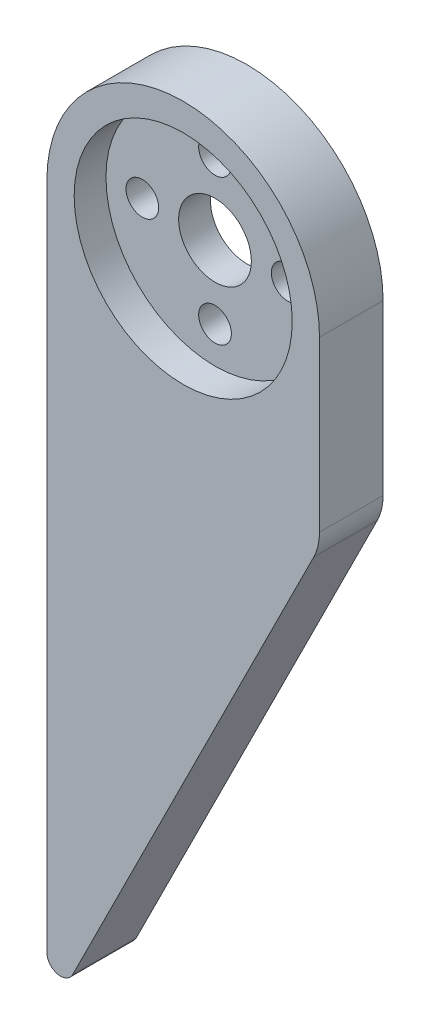
ISO-10303-21;
HEADER;
FILE_DESCRIPTION(('STEP AP214'),'2;1');
FILE_NAME('part.step','',(''),(''),'','','');
FILE_SCHEMA(('AUTOMOTIVE_DESIGN { 1 0 10303 214 1 1 1 1 }'));
ENDSEC;
DATA;
#1=APPLICATION_CONTEXT('core data for automotive mechanical design processes');
#2=APPLICATION_PROTOCOL_DEFINITION('international standard','automotive_design',2000,#1);
#3=PRODUCT_CONTEXT('',#1,'mechanical');
#4=PRODUCT('Part','Part','',(#3));
#5=PRODUCT_RELATED_PRODUCT_CATEGORY('part','',(#4));
#6=PRODUCT_DEFINITION_FORMATION('','',#4);
#7=PRODUCT_DEFINITION_CONTEXT('part definition',#1,'design');
#8=PRODUCT_DEFINITION('design','',#6,#7);
#9=PRODUCT_DEFINITION_SHAPE('','',#8);
#10=(LENGTH_UNIT() NAMED_UNIT(*) SI_UNIT(.MILLI.,.METRE.));
#11=(NAMED_UNIT(*) PLANE_ANGLE_UNIT() SI_UNIT($,.RADIAN.));
#12=(NAMED_UNIT(*) SI_UNIT($,.STERADIAN.) SOLID_ANGLE_UNIT());
#13=UNCERTAINTY_MEASURE_WITH_UNIT(LENGTH_MEASURE(1.E-05),#10,'distance_accuracy_value','');
#14=(GEOMETRIC_REPRESENTATION_CONTEXT(3) GLOBAL_UNCERTAINTY_ASSIGNED_CONTEXT((#13)) GLOBAL_UNIT_ASSIGNED_CONTEXT((#10,
#11,#12)) REPRESENTATION_CONTEXT('',''));
#15=CARTESIAN_POINT('',(0.,0.,0.));
#16=DIRECTION('',(0.,0.,1.));
#17=DIRECTION('',(1.,0.,0.));
#18=AXIS2_PLACEMENT_3D('',#15,#16,#17);
#19=CARTESIAN_POINT('',(0.,8.,7.));
#20=DIRECTION('',(0.,0.,-1.));
#21=DIRECTION('',(-1.,0.,0.));
#22=AXIS2_PLACEMENT_3D('',#19,#20,#21);
#23=CYLINDRICAL_SURFACE('',#22,1.8);
#24=CARTESIAN_POINT('',(0.,8.,0.));
#25=DIRECTION('',(0.,0.,1.));
#26=DIRECTION('',(1.,0.,0.));
#27=AXIS2_PLACEMENT_3D('',#24,#25,#26);
#28=CIRCLE('',#27,1.8);
#29=CARTESIAN_POINT('',(1.8,8.,0.));
#30=VERTEX_POINT('',#29);
#31=EDGE_CURVE('E115',#30,#30,#28,.T.);
#32=ORIENTED_EDGE('',*,*,#31,.F.);
#33=EDGE_LOOP('',(#32));
#34=FACE_BOUND('',#33,.T.);
#35=CARTESIAN_POINT('',(0.,8.,3.5));
#36=DIRECTION('',(0.,0.,1.));
#37=DIRECTION('',(1.,0.,0.));
#38=AXIS2_PLACEMENT_3D('',#35,#36,#37);
#39=CIRCLE('',#38,1.8);
#40=CARTESIAN_POINT('',(1.8,8.,3.5));
#41=VERTEX_POINT('',#40);
#42=EDGE_CURVE('E118',#41,#41,#39,.T.);
#43=ORIENTED_EDGE('',*,*,#42,.T.);
#44=EDGE_LOOP('',(#43));
#45=FACE_BOUND('',#44,.T.);
#46=ADVANCED_FACE('F36',(#34,#45),#23,.F.);
#47=CARTESIAN_POINT('',(8.,0.,7.));
#48=DIRECTION('',(0.,0.,-1.));
#49=DIRECTION('',(-1.,0.,0.));
#50=AXIS2_PLACEMENT_3D('',#47,#48,#49);
#51=CYLINDRICAL_SURFACE('',#50,1.8);
#52=CARTESIAN_POINT('',(8.,0.,0.));
#53=DIRECTION('',(0.,0.,1.));
#54=DIRECTION('',(1.,0.,0.));
#55=AXIS2_PLACEMENT_3D('',#52,#53,#54);
#56=CIRCLE('',#55,1.8);
#57=CARTESIAN_POINT('',(9.8,0.,0.));
#58=VERTEX_POINT('',#57);
#59=EDGE_CURVE('E138',#58,#58,#56,.T.);
#60=ORIENTED_EDGE('',*,*,#59,.F.);
#61=EDGE_LOOP('',(#60));
#62=FACE_BOUND('',#61,.T.);
#63=CARTESIAN_POINT('',(8.,0.,3.5));
#64=DIRECTION('',(0.,0.,1.));
#65=DIRECTION('',(1.,0.,0.));
#66=AXIS2_PLACEMENT_3D('',#63,#64,#65);
#67=CIRCLE('',#66,1.8);
#68=CARTESIAN_POINT('',(9.8,0.,3.5));
#69=VERTEX_POINT('',#68);
#70=EDGE_CURVE('E235',#69,#69,#67,.T.);
#71=ORIENTED_EDGE('',*,*,#70,.T.);
#72=EDGE_LOOP('',(#71));
#73=FACE_BOUND('',#72,.T.);
#74=ADVANCED_FACE('F180',(#62,#73),#51,.F.);
#75=CARTESIAN_POINT('',(0.,-8.,7.));
#76=DIRECTION('',(0.,0.,-1.));
#77=DIRECTION('',(-1.,0.,0.));
#78=AXIS2_PLACEMENT_3D('',#75,#76,#77);
#79=CYLINDRICAL_SURFACE('',#78,1.8);
#80=CARTESIAN_POINT('',(0.,-8.,0.));
#81=DIRECTION('',(0.,0.,1.));
#82=DIRECTION('',(1.,0.,0.));
#83=AXIS2_PLACEMENT_3D('',#80,#81,#82);
#84=CIRCLE('',#83,1.8);
#85=CARTESIAN_POINT('',(1.8,-8.,0.));
#86=VERTEX_POINT('',#85);
#87=EDGE_CURVE('E135',#86,#86,#84,.T.);
#88=ORIENTED_EDGE('',*,*,#87,.F.);
#89=EDGE_LOOP('',(#88));
#90=FACE_BOUND('',#89,.T.);
#91=CARTESIAN_POINT('',(0.,-8.,3.5));
#92=DIRECTION('',(0.,0.,1.));
#93=DIRECTION('',(1.,0.,0.));
#94=AXIS2_PLACEMENT_3D('',#91,#92,#93);
#95=CIRCLE('',#94,1.8);
#96=CARTESIAN_POINT('',(1.8,-8.,3.5));
#97=VERTEX_POINT('',#96);
#98=EDGE_CURVE('E224',#97,#97,#95,.T.);
#99=ORIENTED_EDGE('',*,*,#98,.T.);
#100=EDGE_LOOP('',(#99));
#101=FACE_BOUND('',#100,.T.);
#102=ADVANCED_FACE('F186',(#90,#101),#79,.F.);
#103=CARTESIAN_POINT('',(-8.,0.,7.));
#104=DIRECTION('',(0.,0.,-1.));
#105=DIRECTION('',(-1.,0.,0.));
#106=AXIS2_PLACEMENT_3D('',#103,#104,#105);
#107=CYLINDRICAL_SURFACE('',#106,1.8);
#108=CARTESIAN_POINT('',(-8.,0.,0.));
#109=DIRECTION('',(0.,0.,1.));
#110=DIRECTION('',(1.,0.,0.));
#111=AXIS2_PLACEMENT_3D('',#108,#109,#110);
#112=CIRCLE('',#111,1.8);
#113=CARTESIAN_POINT('',(-6.2,0.,0.));
#114=VERTEX_POINT('',#113);
#115=EDGE_CURVE('E132',#114,#114,#112,.T.);
#116=ORIENTED_EDGE('',*,*,#115,.F.);
#117=EDGE_LOOP('',(#116));
#118=FACE_BOUND('',#117,.T.);
#119=CARTESIAN_POINT('',(-8.,0.,3.5));
#120=DIRECTION('',(0.,0.,1.));
#121=DIRECTION('',(1.,0.,0.));
#122=AXIS2_PLACEMENT_3D('',#119,#120,#121);
#123=CIRCLE('',#122,1.8);
#124=CARTESIAN_POINT('',(-6.2,0.,3.5));
#125=VERTEX_POINT('',#124);
#126=EDGE_CURVE('E221',#125,#125,#123,.T.);
#127=ORIENTED_EDGE('',*,*,#126,.T.);
#128=EDGE_LOOP('',(#127));
#129=FACE_BOUND('',#128,.T.);
#130=ADVANCED_FACE('F197',(#118,#129),#107,.F.);
#131=CARTESIAN_POINT('',(0.,0.,7.));
#132=DIRECTION('',(0.,0.,-1.));
#133=DIRECTION('',(-1.,0.,0.));
#134=AXIS2_PLACEMENT_3D('',#131,#132,#133);
#135=CYLINDRICAL_SURFACE('',#134,4.);
#136=CARTESIAN_POINT('',(0.,0.,0.));
#137=DIRECTION('',(0.,0.,1.));
#138=DIRECTION('',(1.,0.,0.));
#139=AXIS2_PLACEMENT_3D('',#136,#137,#138);
#140=CIRCLE('',#139,4.);
#141=CARTESIAN_POINT('',(4.,0.,0.));
#142=VERTEX_POINT('',#141);
#143=EDGE_CURVE('E112',#142,#142,#140,.T.);
#144=ORIENTED_EDGE('',*,*,#143,.F.);
#145=EDGE_LOOP('',(#144));
#146=FACE_BOUND('',#145,.T.);
#147=CARTESIAN_POINT('',(0.,0.,3.5));
#148=DIRECTION('',(0.,0.,1.));
#149=DIRECTION('',(1.,0.,0.));
#150=AXIS2_PLACEMENT_3D('',#147,#148,#149);
#151=CIRCLE('',#150,4.);
#152=CARTESIAN_POINT('',(4.,0.,3.5));
#153=VERTEX_POINT('',#152);
#154=EDGE_CURVE('E40',#153,#153,#151,.T.);
#155=ORIENTED_EDGE('',*,*,#154,.T.);
#156=EDGE_LOOP('',(#155));
#157=FACE_BOUND('',#156,.T.);
#158=ADVANCED_FACE('F192',(#146,#157),#135,.F.);
#159=CARTESIAN_POINT('',(15.,0.,7.));
#160=DIRECTION('',(1.,0.,0.));
#161=DIRECTION('',(0.,1.,0.));
#162=AXIS2_PLACEMENT_3D('',#159,#160,#161);
#163=PLANE('',#162);
#164=DIRECTION('',(0.,-1.,0.));
#165=VECTOR('',#164,1.);
#166=CARTESIAN_POINT('',(15.,0.,7.));
#167=LINE('',#166,#165);
#168=CARTESIAN_POINT('',(15.,0.,7.));
#169=VERTEX_POINT('',#168);
#170=CARTESIAN_POINT('',(15.,-18.5835921350013,7.));
#171=VERTEX_POINT('',#170);
#172=EDGE_CURVE('E93',#169,#171,#167,.T.);
#173=ORIENTED_EDGE('',*,*,#172,.T.);
#174=DIRECTION('',(0.,0.,-1.));
#175=VECTOR('',#174,1.);
#176=CARTESIAN_POINT('',(15.,-18.5835921350013,7.));
#177=LINE('',#176,#175);
#178=CARTESIAN_POINT('',(15.,-18.5835921350013,0.));
#179=VERTEX_POINT('',#178);
#180=EDGE_CURVE('E153',#171,#179,#177,.T.);
#181=ORIENTED_EDGE('',*,*,#180,.T.);
#182=DIRECTION('',(0.,-1.,0.));
#183=VECTOR('',#182,1.);
#184=CARTESIAN_POINT('',(15.,0.,0.));
#185=LINE('',#184,#183);
#186=CARTESIAN_POINT('',(15.,0.,0.));
#187=VERTEX_POINT('',#186);
#188=EDGE_CURVE('E95',#187,#179,#185,.T.);
#189=ORIENTED_EDGE('',*,*,#188,.F.);
#190=DIRECTION('',(0.,0.,-1.));
#191=VECTOR('',#190,1.);
#192=CARTESIAN_POINT('',(15.,0.,7.));
#193=LINE('',#192,#191);
#194=EDGE_CURVE('E88',#169,#187,#193,.T.);
#195=ORIENTED_EDGE('',*,*,#194,.F.);
#196=EDGE_LOOP('',(#173,#181,#189,#195));
#197=FACE_BOUND('',#196,.T.);
#198=ADVANCED_FACE('F90',(#197),#163,.T.);
#199=CARTESIAN_POINT('',(0.,0.,7.));
#200=DIRECTION('',(0.,0.,-1.));
#201=DIRECTION('',(-1.,0.,0.));
#202=AXIS2_PLACEMENT_3D('',#199,#200,#201);
#203=CYLINDRICAL_SURFACE('',#202,15.);
#204=CARTESIAN_POINT('',(0.,0.,0.));
#205=DIRECTION('',(0.,0.,1.));
#206=DIRECTION('',(1.,0.,0.));
#207=AXIS2_PLACEMENT_3D('',#204,#205,#206);
#208=CIRCLE('',#207,15.);
#209=CARTESIAN_POINT('',(-15.,0.,0.));
#210=VERTEX_POINT('',#209);
#211=EDGE_CURVE('E125',#187,#210,#208,.T.);
#212=ORIENTED_EDGE('',*,*,#211,.T.);
#213=DIRECTION('',(0.,0.,-1.));
#214=VECTOR('',#213,1.);
#215=CARTESIAN_POINT('',(-15.,0.,7.));
#216=LINE('',#215,#214);
#217=CARTESIAN_POINT('',(-15.,0.,7.));
#218=VERTEX_POINT('',#217);
#219=EDGE_CURVE('E99',#218,#210,#216,.T.);
#220=ORIENTED_EDGE('',*,*,#219,.F.);
#221=CARTESIAN_POINT('',(0.,0.,7.));
#222=DIRECTION('',(0.,0.,1.));
#223=DIRECTION('',(1.,0.,0.));
#224=AXIS2_PLACEMENT_3D('',#221,#222,#223);
#225=CIRCLE('',#224,15.);
#226=EDGE_CURVE('E102',#169,#218,#225,.T.);
#227=ORIENTED_EDGE('',*,*,#226,.F.);
#228=ORIENTED_EDGE('',*,*,#194,.T.);
#229=EDGE_LOOP('',(#212,#220,#227,#228));
#230=FACE_BOUND('',#229,.T.);
#231=ADVANCED_FACE('F103',(#230),#203,.T.);
#232=CARTESIAN_POINT('',(-15.,0.,7.));
#233=DIRECTION('',(1.,0.,0.));
#234=DIRECTION('',(0.,1.,0.));
#235=AXIS2_PLACEMENT_3D('',#232,#233,#234);
#236=PLANE('',#235);
#237=DIRECTION('',(0.,-1.,0.));
#238=VECTOR('',#237,1.);
#239=CARTESIAN_POINT('',(-15.,0.,0.));
#240=LINE('',#239,#238);
#241=CARTESIAN_POINT('',(-15.,-73.6458980337503,0.));
#242=VERTEX_POINT('',#241);
#243=EDGE_CURVE('E127',#210,#242,#240,.T.);
#244=ORIENTED_EDGE('',*,*,#243,.T.);
#245=DIRECTION('',(0.,0.,-1.));
#246=VECTOR('',#245,1.);
#247=CARTESIAN_POINT('',(-15.,-73.6458980337503,7.));
#248=LINE('',#247,#246);
#249=CARTESIAN_POINT('',(-15.,-73.6458980337503,7.));
#250=VERTEX_POINT('',#249);
#251=EDGE_CURVE('E148',#242,#250,#248,.F.);
#252=ORIENTED_EDGE('',*,*,#251,.T.);
#253=DIRECTION('',(0.,-1.,0.));
#254=VECTOR('',#253,1.);
#255=CARTESIAN_POINT('',(-15.,0.,7.));
#256=LINE('',#255,#254);
#257=EDGE_CURVE('E108',#218,#250,#256,.T.);
#258=ORIENTED_EDGE('',*,*,#257,.F.);
#259=ORIENTED_EDGE('',*,*,#219,.T.);
#260=EDGE_LOOP('',(#244,#252,#258,#259));
#261=FACE_BOUND('',#260,.T.);
#262=ADVANCED_FACE('F161',(#261),#236,.F.);
#263=CARTESIAN_POINT('',(20.,-9.99999999999999,7.));
#264=DIRECTION('',(0.894427190999916,-0.447213595499958,0.));
#265=DIRECTION('',(0.447213595499958,0.894427190999916,0.));
#266=AXIS2_PLACEMENT_3D('',#263,#264,#265);
#267=PLANE('',#266);
#268=DIRECTION('',(-0.447213595499958,-0.894427190999916,0.));
#269=VECTOR('',#268,1.);
#270=CARTESIAN_POINT('',(20.,-9.99999999999999,0.));
#271=LINE('',#270,#269);
#272=CARTESIAN_POINT('',(14.3665631459995,-21.266873708001,0.));
#273=VERTEX_POINT('',#272);
#274=CARTESIAN_POINT('',(-12.1583592135001,-74.3167184270003,0.));
#275=VERTEX_POINT('',#274);
#276=EDGE_CURVE('E130',#273,#275,#271,.T.);
#277=ORIENTED_EDGE('',*,*,#276,.F.);
#278=DIRECTION('',(0.,0.,-1.));
#279=VECTOR('',#278,1.);
#280=CARTESIAN_POINT('',(14.3665631459995,-21.266873708001,7.));
#281=LINE('',#280,#279);
#282=CARTESIAN_POINT('',(14.3665631459995,-21.266873708001,7.));
#283=VERTEX_POINT('',#282);
#284=EDGE_CURVE('E45',#273,#283,#281,.F.);
#285=ORIENTED_EDGE('',*,*,#284,.T.);
#286=DIRECTION('',(-0.447213595499958,-0.894427190999916,0.));
#287=VECTOR('',#286,1.);
#288=CARTESIAN_POINT('',(20.,-9.99999999999999,7.));
#289=LINE('',#288,#287);
#290=CARTESIAN_POINT('',(-12.1583592135001,-74.3167184270003,7.));
#291=VERTEX_POINT('',#290);
#292=EDGE_CURVE('E122',#283,#291,#289,.T.);
#293=ORIENTED_EDGE('',*,*,#292,.T.);
#294=DIRECTION('',(0.,0.,-1.));
#295=VECTOR('',#294,1.);
#296=CARTESIAN_POINT('',(-12.1583592135001,-74.3167184270003,0.));
#297=LINE('',#296,#295);
#298=EDGE_CURVE('E98',#291,#275,#297,.T.);
#299=ORIENTED_EDGE('',*,*,#298,.T.);
#300=EDGE_LOOP('',(#277,#285,#293,#299));
#301=FACE_BOUND('',#300,.T.);
#302=ADVANCED_FACE('F168',(#301),#267,.T.);
#303=CARTESIAN_POINT('',(0.,0.,7.));
#304=DIRECTION('',(0.,0.,1.));
#305=DIRECTION('',(1.,0.,0.));
#306=AXIS2_PLACEMENT_3D('',#303,#304,#305);
#307=PLANE('',#306);
#308=CARTESIAN_POINT('',(0.,0.,7.));
#309=DIRECTION('',(0.,0.,1.));
#310=DIRECTION('',(1.,0.,0.));
#311=AXIS2_PLACEMENT_3D('',#308,#309,#310);
#312=CIRCLE('',#311,12.);
#313=CARTESIAN_POINT('',(12.,0.,7.));
#314=VERTEX_POINT('',#313);
#315=EDGE_CURVE('E227',#314,#314,#312,.T.);
#316=ORIENTED_EDGE('',*,*,#315,.F.);
#317=EDGE_LOOP('',(#316));
#318=FACE_BOUND('',#317,.T.);
#319=ORIENTED_EDGE('',*,*,#292,.F.);
#320=CARTESIAN_POINT('',(9.,-18.5835921350013,7.));
#321=DIRECTION('',(0.,0.,1.));
#322=DIRECTION('',(1.,0.,0.));
#323=AXIS2_PLACEMENT_3D('',#320,#321,#322);
#324=CIRCLE('',#323,6.);
#325=EDGE_CURVE('E11',#283,#171,#324,.T.);
#326=ORIENTED_EDGE('',*,*,#325,.T.);
#327=ORIENTED_EDGE('',*,*,#172,.F.);
#328=ORIENTED_EDGE('',*,*,#226,.T.);
#329=ORIENTED_EDGE('',*,*,#257,.T.);
#330=CARTESIAN_POINT('',(-13.5,-73.6458980337503,7.));
#331=DIRECTION('',(0.,0.,1.));
#332=DIRECTION('',(1.,0.,0.));
#333=AXIS2_PLACEMENT_3D('',#330,#331,#332);
#334=CIRCLE('',#333,1.5);
#335=EDGE_CURVE('E150',#250,#291,#334,.T.);
#336=ORIENTED_EDGE('',*,*,#335,.T.);
#337=EDGE_LOOP('',(#319,#326,#327,#328,#329,#336));
#338=FACE_BOUND('',#337,.T.);
#339=ADVANCED_FACE('F110',(#318,#338),#307,.T.);
#340=CARTESIAN_POINT('',(0.,0.,0.));
#341=DIRECTION('',(0.,0.,1.));
#342=DIRECTION('',(1.,0.,0.));
#343=AXIS2_PLACEMENT_3D('',#340,#341,#342);
#344=PLANE('',#343);
#345=ORIENTED_EDGE('',*,*,#188,.T.);
#346=CARTESIAN_POINT('',(9.,-18.5835921350013,0.));
#347=DIRECTION('',(0.,0.,1.));
#348=DIRECTION('',(1.,0.,0.));
#349=AXIS2_PLACEMENT_3D('',#346,#347,#348);
#350=CIRCLE('',#349,6.);
#351=EDGE_CURVE('E59',#179,#273,#350,.F.);
#352=ORIENTED_EDGE('',*,*,#351,.T.);
#353=ORIENTED_EDGE('',*,*,#276,.T.);
#354=CARTESIAN_POINT('',(-13.5,-73.6458980337503,0.));
#355=DIRECTION('',(0.,0.,1.));
#356=DIRECTION('',(1.,0.,0.));
#357=AXIS2_PLACEMENT_3D('',#354,#355,#356);
#358=CIRCLE('',#357,1.5);
#359=EDGE_CURVE('E146',#275,#242,#358,.F.);
#360=ORIENTED_EDGE('',*,*,#359,.T.);
#361=ORIENTED_EDGE('',*,*,#243,.F.);
#362=ORIENTED_EDGE('',*,*,#211,.F.);
#363=EDGE_LOOP('',(#345,#352,#353,#360,#361,#362));
#364=FACE_BOUND('',#363,.T.);
#365=ORIENTED_EDGE('',*,*,#115,.T.);
#366=EDGE_LOOP('',(#365));
#367=FACE_BOUND('',#366,.T.);
#368=ORIENTED_EDGE('',*,*,#87,.T.);
#369=EDGE_LOOP('',(#368));
#370=FACE_BOUND('',#369,.T.);
#371=ORIENTED_EDGE('',*,*,#59,.T.);
#372=EDGE_LOOP('',(#371));
#373=FACE_BOUND('',#372,.T.);
#374=ORIENTED_EDGE('',*,*,#31,.T.);
#375=EDGE_LOOP('',(#374));
#376=FACE_BOUND('',#375,.T.);
#377=ORIENTED_EDGE('',*,*,#143,.T.);
#378=EDGE_LOOP('',(#377));
#379=FACE_BOUND('',#378,.T.);
#380=ADVANCED_FACE('F157',(#364,#367,#370,#373,#376,#379),#344,.F.);
#381=CARTESIAN_POINT('',(-13.5,-73.6458980337503,7.));
#382=DIRECTION('',(0.,0.,1.));
#383=DIRECTION('',(1.,0.,0.));
#384=AXIS2_PLACEMENT_3D('',#381,#382,#383);
#385=CYLINDRICAL_SURFACE('',#384,1.5);
#386=ORIENTED_EDGE('',*,*,#335,.F.);
#387=ORIENTED_EDGE('',*,*,#251,.F.);
#388=ORIENTED_EDGE('',*,*,#359,.F.);
#389=ORIENTED_EDGE('',*,*,#298,.F.);
#390=EDGE_LOOP('',(#386,#387,#388,#389));
#391=FACE_BOUND('',#390,.T.);
#392=ADVANCED_FACE('F166',(#391),#385,.T.);
#393=CARTESIAN_POINT('',(9.,-18.5835921350013,7.));
#394=DIRECTION('',(0.,0.,-1.));
#395=DIRECTION('',(-1.,0.,0.));
#396=AXIS2_PLACEMENT_3D('',#393,#394,#395);
#397=CYLINDRICAL_SURFACE('',#396,6.);
#398=ORIENTED_EDGE('',*,*,#325,.F.);
#399=ORIENTED_EDGE('',*,*,#284,.F.);
#400=ORIENTED_EDGE('',*,*,#351,.F.);
#401=ORIENTED_EDGE('',*,*,#180,.F.);
#402=EDGE_LOOP('',(#398,#399,#400,#401));
#403=FACE_BOUND('',#402,.T.);
#404=ADVANCED_FACE('F38',(#403),#397,.T.);
#405=CARTESIAN_POINT('',(0.,0.,3.5));
#406=DIRECTION('',(0.,0.,1.));
#407=DIRECTION('',(1.,0.,0.));
#408=AXIS2_PLACEMENT_3D('',#405,#406,#407);
#409=CYLINDRICAL_SURFACE('',#408,12.);
#410=CARTESIAN_POINT('',(0.,0.,3.5));
#411=DIRECTION('',(0.,0.,1.));
#412=DIRECTION('',(1.,0.,0.));
#413=AXIS2_PLACEMENT_3D('',#410,#411,#412);
#414=CIRCLE('',#413,12.);
#415=CARTESIAN_POINT('',(12.,0.,3.5));
#416=VERTEX_POINT('',#415);
#417=EDGE_CURVE('E222',#416,#416,#414,.T.);
#418=ORIENTED_EDGE('',*,*,#417,.F.);
#419=EDGE_LOOP('',(#418));
#420=FACE_BOUND('',#419,.T.);
#421=ORIENTED_EDGE('',*,*,#315,.T.);
#422=EDGE_LOOP('',(#421));
#423=FACE_BOUND('',#422,.T.);
#424=ADVANCED_FACE('F170',(#420,#423),#409,.F.);
#425=CARTESIAN_POINT('',(0.,0.,3.5));
#426=DIRECTION('',(0.,0.,1.));
#427=DIRECTION('',(1.,0.,0.));
#428=AXIS2_PLACEMENT_3D('',#425,#426,#427);
#429=PLANE('',#428);
#430=ORIENTED_EDGE('',*,*,#42,.F.);
#431=EDGE_LOOP('',(#430));
#432=FACE_BOUND('',#431,.T.);
#433=ORIENTED_EDGE('',*,*,#70,.F.);
#434=EDGE_LOOP('',(#433));
#435=FACE_BOUND('',#434,.T.);
#436=ORIENTED_EDGE('',*,*,#98,.F.);
#437=EDGE_LOOP('',(#436));
#438=FACE_BOUND('',#437,.T.);
#439=ORIENTED_EDGE('',*,*,#126,.F.);
#440=EDGE_LOOP('',(#439));
#441=FACE_BOUND('',#440,.T.);
#442=ORIENTED_EDGE('',*,*,#154,.F.);
#443=EDGE_LOOP('',(#442));
#444=FACE_BOUND('',#443,.T.);
#445=ORIENTED_EDGE('',*,*,#417,.T.);
#446=EDGE_LOOP('',(#445));
#447=FACE_BOUND('',#446,.T.);
#448=ADVANCED_FACE('F176',(#432,#435,#438,#441,#444,#447),#429,.T.);
#449=CLOSED_SHELL('',(#46,#74,#102,#130,#158,#198,#231,#262,#302,#339,#380,#392,#404,#424,#448));
#450=MANIFOLD_SOLID_BREP('B2',#449);
#451=ADVANCED_BREP_SHAPE_REPRESENTATION('',(#18,#450),#14);
#452=SHAPE_DEFINITION_REPRESENTATION(#9,#451);
ENDSEC;
END-ISO-10303-21;
